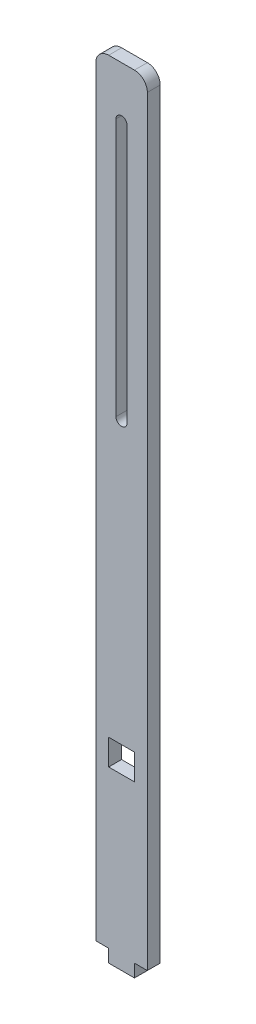
ISO-10303-21;
HEADER;
FILE_DESCRIPTION(('STEP AP214'),'2;1');
FILE_NAME('part.step','',(''),(''),'','','');
FILE_SCHEMA(('AUTOMOTIVE_DESIGN { 1 0 10303 214 1 1 1 1 }'));
ENDSEC;
DATA;
#1=APPLICATION_CONTEXT('core data for automotive mechanical design processes');
#2=APPLICATION_PROTOCOL_DEFINITION('international standard','automotive_design',2000,#1);
#3=PRODUCT_CONTEXT('',#1,'mechanical');
#4=PRODUCT('Part','Part','',(#3));
#5=PRODUCT_RELATED_PRODUCT_CATEGORY('part','',(#4));
#6=PRODUCT_DEFINITION_FORMATION('','',#4);
#7=PRODUCT_DEFINITION_CONTEXT('part definition',#1,'design');
#8=PRODUCT_DEFINITION('design','',#6,#7);
#9=PRODUCT_DEFINITION_SHAPE('','',#8);
#10=(LENGTH_UNIT() NAMED_UNIT(*) SI_UNIT(.MILLI.,.METRE.));
#11=(NAMED_UNIT(*) PLANE_ANGLE_UNIT() SI_UNIT($,.RADIAN.));
#12=(NAMED_UNIT(*) SI_UNIT($,.STERADIAN.) SOLID_ANGLE_UNIT());
#13=UNCERTAINTY_MEASURE_WITH_UNIT(LENGTH_MEASURE(1.E-05),#10,'distance_accuracy_value','');
#14=(GEOMETRIC_REPRESENTATION_CONTEXT(3) GLOBAL_UNCERTAINTY_ASSIGNED_CONTEXT((#13)) GLOBAL_UNIT_ASSIGNED_CONTEXT((#10,
#11,#12)) REPRESENTATION_CONTEXT('',''));
#15=CARTESIAN_POINT('',(0.,0.,0.));
#16=DIRECTION('',(0.,0.,1.));
#17=DIRECTION('',(1.,0.,0.));
#18=AXIS2_PLACEMENT_3D('',#15,#16,#17);
#19=CARTESIAN_POINT('',(12.7,190.5,6.35));
#20=DIRECTION('',(-1.,0.,0.));
#21=DIRECTION('',(0.,-1.,0.));
#22=AXIS2_PLACEMENT_3D('',#19,#20,#21);
#23=PLANE('',#22);
#24=DIRECTION('',(0.,1.,0.));
#25=VECTOR('',#24,1.);
#26=CARTESIAN_POINT('',(12.7,190.5,0.));
#27=LINE('',#26,#25);
#28=CARTESIAN_POINT('',(12.7,-190.5,0.));
#29=VERTEX_POINT('',#28);
#30=CARTESIAN_POINT('',(12.7,184.15,0.));
#31=VERTEX_POINT('',#30);
#32=EDGE_CURVE('E256',#29,#31,#27,.T.);
#33=ORIENTED_EDGE('',*,*,#32,.T.);
#34=DIRECTION('',(0.,0.,-1.));
#35=VECTOR('',#34,1.);
#36=CARTESIAN_POINT('',(12.7,184.15,6.35));
#37=LINE('',#36,#35);
#38=CARTESIAN_POINT('',(12.7,184.15,6.35));
#39=VERTEX_POINT('',#38);
#40=EDGE_CURVE('E11',#31,#39,#37,.F.);
#41=ORIENTED_EDGE('',*,*,#40,.T.);
#42=DIRECTION('',(0.,1.,0.));
#43=VECTOR('',#42,1.);
#44=CARTESIAN_POINT('',(12.7,190.5,6.35));
#45=LINE('',#44,#43);
#46=CARTESIAN_POINT('',(12.7,-190.5,6.35));
#47=VERTEX_POINT('',#46);
#48=EDGE_CURVE('E266',#47,#39,#45,.T.);
#49=ORIENTED_EDGE('',*,*,#48,.F.);
#50=DIRECTION('',(0.,0.,-1.));
#51=VECTOR('',#50,1.);
#52=CARTESIAN_POINT('',(12.7,-190.5,6.35));
#53=LINE('',#52,#51);
#54=EDGE_CURVE('E291',#47,#29,#53,.T.);
#55=ORIENTED_EDGE('',*,*,#54,.T.);
#56=EDGE_LOOP('',(#33,#41,#49,#55));
#57=FACE_BOUND('',#56,.T.);
#58=ADVANCED_FACE('F38',(#57),#23,.F.);
#59=CARTESIAN_POINT('',(-12.7,190.5,6.35));
#60=DIRECTION('',(0.,-1.,0.));
#61=DIRECTION('',(0.,0.,-1.));
#62=AXIS2_PLACEMENT_3D('',#59,#60,#61);
#63=PLANE('',#62);
#64=DIRECTION('',(-1.,0.,0.));
#65=VECTOR('',#64,1.);
#66=CARTESIAN_POINT('',(-12.7,190.5,0.));
#67=LINE('',#66,#65);
#68=CARTESIAN_POINT('',(6.34999999999997,190.5,0.));
#69=VERTEX_POINT('',#68);
#70=CARTESIAN_POINT('',(-6.35000000000002,190.5,0.));
#71=VERTEX_POINT('',#70);
#72=EDGE_CURVE('E294',#69,#71,#67,.T.);
#73=ORIENTED_EDGE('',*,*,#72,.T.);
#74=DIRECTION('',(0.,0.,-1.));
#75=VECTOR('',#74,1.);
#76=CARTESIAN_POINT('',(-6.35000000000002,190.5,6.35));
#77=LINE('',#76,#75);
#78=CARTESIAN_POINT('',(-6.35000000000002,190.5,6.35));
#79=VERTEX_POINT('',#78);
#80=EDGE_CURVE('E60',#71,#79,#77,.F.);
#81=ORIENTED_EDGE('',*,*,#80,.T.);
#82=DIRECTION('',(-1.,0.,0.));
#83=VECTOR('',#82,1.);
#84=CARTESIAN_POINT('',(-12.7,190.5,6.35));
#85=LINE('',#84,#83);
#86=CARTESIAN_POINT('',(6.34999999999997,190.5,6.35));
#87=VERTEX_POINT('',#86);
#88=EDGE_CURVE('E269',#87,#79,#85,.T.);
#89=ORIENTED_EDGE('',*,*,#88,.F.);
#90=DIRECTION('',(0.,0.,-1.));
#91=VECTOR('',#90,1.);
#92=CARTESIAN_POINT('',(6.34999999999997,190.5,6.35));
#93=LINE('',#92,#91);
#94=EDGE_CURVE('E347',#87,#69,#93,.T.);
#95=ORIENTED_EDGE('',*,*,#94,.T.);
#96=EDGE_LOOP('',(#73,#81,#89,#95));
#97=FACE_BOUND('',#96,.T.);
#98=ADVANCED_FACE('F371',(#97),#63,.F.);
#99=CARTESIAN_POINT('',(-12.7,190.5,6.35));
#100=DIRECTION('',(1.,0.,0.));
#101=DIRECTION('',(0.,1.,0.));
#102=AXIS2_PLACEMENT_3D('',#99,#100,#101);
#103=PLANE('',#102);
#104=DIRECTION('',(0.,-1.,0.));
#105=VECTOR('',#104,1.);
#106=CARTESIAN_POINT('',(-12.7,190.5,6.35));
#107=LINE('',#106,#105);
#108=CARTESIAN_POINT('',(-12.7,184.15,6.35));
#109=VERTEX_POINT('',#108);
#110=CARTESIAN_POINT('',(-12.7,-190.5,6.35));
#111=VERTEX_POINT('',#110);
#112=EDGE_CURVE('E273',#109,#111,#107,.T.);
#113=ORIENTED_EDGE('',*,*,#112,.F.);
#114=DIRECTION('',(0.,0.,-1.));
#115=VECTOR('',#114,1.);
#116=CARTESIAN_POINT('',(-12.7,184.15,6.35));
#117=LINE('',#116,#115);
#118=CARTESIAN_POINT('',(-12.7,184.15,0.));
#119=VERTEX_POINT('',#118);
#120=EDGE_CURVE('E337',#109,#119,#117,.T.);
#121=ORIENTED_EDGE('',*,*,#120,.T.);
#122=DIRECTION('',(0.,-1.,0.));
#123=VECTOR('',#122,1.);
#124=CARTESIAN_POINT('',(-12.7,190.5,0.));
#125=LINE('',#124,#123);
#126=CARTESIAN_POINT('',(-12.7,-190.5,0.));
#127=VERTEX_POINT('',#126);
#128=EDGE_CURVE('E297',#119,#127,#125,.T.);
#129=ORIENTED_EDGE('',*,*,#128,.T.);
#130=DIRECTION('',(0.,0.,-1.));
#131=VECTOR('',#130,1.);
#132=CARTESIAN_POINT('',(-12.7,-190.5,6.35));
#133=LINE('',#132,#131);
#134=EDGE_CURVE('E333',#111,#127,#133,.T.);
#135=ORIENTED_EDGE('',*,*,#134,.F.);
#136=EDGE_LOOP('',(#113,#121,#129,#135));
#137=FACE_BOUND('',#136,.T.);
#138=ADVANCED_FACE('F364',(#137),#103,.F.);
#139=CARTESIAN_POINT('',(-12.7,-190.5,6.35));
#140=DIRECTION('',(0.,1.,0.));
#141=DIRECTION('',(0.,0.,1.));
#142=AXIS2_PLACEMENT_3D('',#139,#140,#141);
#143=PLANE('',#142);
#144=DIRECTION('',(1.,0.,0.));
#145=VECTOR('',#144,1.);
#146=CARTESIAN_POINT('',(-12.7,-190.5,0.));
#147=LINE('',#146,#145);
#148=CARTESIAN_POINT('',(-6.34999999999998,-190.5,0.));
#149=VERTEX_POINT('',#148);
#150=EDGE_CURVE('E300',#127,#149,#147,.T.);
#151=ORIENTED_EDGE('',*,*,#150,.T.);
#152=DIRECTION('',(0.,0.,-1.));
#153=VECTOR('',#152,1.);
#154=CARTESIAN_POINT('',(-6.34999999999998,-190.5,6.35));
#155=LINE('',#154,#153);
#156=CARTESIAN_POINT('',(-6.34999999999998,-190.5,6.35));
#157=VERTEX_POINT('',#156);
#158=EDGE_CURVE('E329',#157,#149,#155,.T.);
#159=ORIENTED_EDGE('',*,*,#158,.F.);
#160=DIRECTION('',(1.,0.,0.));
#161=VECTOR('',#160,1.);
#162=CARTESIAN_POINT('',(-12.7,-190.5,6.35));
#163=LINE('',#162,#161);
#164=EDGE_CURVE('E276',#111,#157,#163,.T.);
#165=ORIENTED_EDGE('',*,*,#164,.F.);
#166=ORIENTED_EDGE('',*,*,#134,.T.);
#167=EDGE_LOOP('',(#151,#159,#165,#166));
#168=FACE_BOUND('',#167,.T.);
#169=ADVANCED_FACE('F398',(#168),#143,.F.);
#170=CARTESIAN_POINT('',(-6.34999999999998,-190.5,6.35));
#171=DIRECTION('',(1.,0.,0.));
#172=DIRECTION('',(0.,0.,-1.));
#173=AXIS2_PLACEMENT_3D('',#170,#171,#172);
#174=PLANE('',#173);
#175=DIRECTION('',(0.,-1.,0.));
#176=VECTOR('',#175,1.);
#177=CARTESIAN_POINT('',(-6.34999999999998,-190.5,0.));
#178=LINE('',#177,#176);
#179=CARTESIAN_POINT('',(-6.34999999999998,-196.85,0.));
#180=VERTEX_POINT('',#179);
#181=EDGE_CURVE('E303',#149,#180,#178,.T.);
#182=ORIENTED_EDGE('',*,*,#181,.T.);
#183=DIRECTION('',(0.,0.,-1.));
#184=VECTOR('',#183,1.);
#185=CARTESIAN_POINT('',(-6.34999999999998,-196.85,6.35));
#186=LINE('',#185,#184);
#187=CARTESIAN_POINT('',(-6.34999999999998,-196.85,6.35));
#188=VERTEX_POINT('',#187);
#189=EDGE_CURVE('E325',#188,#180,#186,.T.);
#190=ORIENTED_EDGE('',*,*,#189,.F.);
#191=DIRECTION('',(0.,-1.,0.));
#192=VECTOR('',#191,1.);
#193=CARTESIAN_POINT('',(-6.34999999999998,-190.5,6.35));
#194=LINE('',#193,#192);
#195=EDGE_CURVE('E279',#157,#188,#194,.T.);
#196=ORIENTED_EDGE('',*,*,#195,.F.);
#197=ORIENTED_EDGE('',*,*,#158,.T.);
#198=EDGE_LOOP('',(#182,#190,#196,#197));
#199=FACE_BOUND('',#198,.T.);
#200=ADVANCED_FACE('F395',(#199),#174,.F.);
#201=CARTESIAN_POINT('',(-6.34999999999998,-196.85,6.35));
#202=DIRECTION('',(0.,1.,0.));
#203=DIRECTION('',(0.,0.,1.));
#204=AXIS2_PLACEMENT_3D('',#201,#202,#203);
#205=PLANE('',#204);
#206=DIRECTION('',(1.,0.,0.));
#207=VECTOR('',#206,1.);
#208=CARTESIAN_POINT('',(-6.34999999999998,-196.85,0.));
#209=LINE('',#208,#207);
#210=CARTESIAN_POINT('',(6.35000000000002,-196.85,0.));
#211=VERTEX_POINT('',#210);
#212=EDGE_CURVE('E306',#180,#211,#209,.T.);
#213=ORIENTED_EDGE('',*,*,#212,.T.);
#214=DIRECTION('',(0.,0.,-1.));
#215=VECTOR('',#214,1.);
#216=CARTESIAN_POINT('',(6.35000000000002,-196.85,6.35));
#217=LINE('',#216,#215);
#218=CARTESIAN_POINT('',(6.35000000000002,-196.85,6.35));
#219=VERTEX_POINT('',#218);
#220=EDGE_CURVE('E321',#219,#211,#217,.T.);
#221=ORIENTED_EDGE('',*,*,#220,.F.);
#222=DIRECTION('',(1.,0.,0.));
#223=VECTOR('',#222,1.);
#224=CARTESIAN_POINT('',(-6.34999999999998,-196.85,6.35));
#225=LINE('',#224,#223);
#226=EDGE_CURVE('E282',#188,#219,#225,.T.);
#227=ORIENTED_EDGE('',*,*,#226,.F.);
#228=ORIENTED_EDGE('',*,*,#189,.T.);
#229=EDGE_LOOP('',(#213,#221,#227,#228));
#230=FACE_BOUND('',#229,.T.);
#231=ADVANCED_FACE('F391',(#230),#205,.F.);
#232=CARTESIAN_POINT('',(6.35000000000002,-190.5,6.35));
#233=DIRECTION('',(-1.,0.,0.));
#234=DIRECTION('',(0.,-1.,0.));
#235=AXIS2_PLACEMENT_3D('',#232,#233,#234);
#236=PLANE('',#235);
#237=DIRECTION('',(0.,1.,0.));
#238=VECTOR('',#237,1.);
#239=CARTESIAN_POINT('',(6.35000000000002,-190.5,0.));
#240=LINE('',#239,#238);
#241=CARTESIAN_POINT('',(6.35000000000002,-190.5,0.));
#242=VERTEX_POINT('',#241);
#243=EDGE_CURVE('E309',#211,#242,#240,.T.);
#244=ORIENTED_EDGE('',*,*,#243,.T.);
#245=DIRECTION('',(0.,0.,-1.));
#246=VECTOR('',#245,1.);
#247=CARTESIAN_POINT('',(6.35000000000002,-190.5,6.35));
#248=LINE('',#247,#246);
#249=CARTESIAN_POINT('',(6.35000000000002,-190.5,6.35));
#250=VERTEX_POINT('',#249);
#251=EDGE_CURVE('E317',#250,#242,#248,.T.);
#252=ORIENTED_EDGE('',*,*,#251,.F.);
#253=DIRECTION('',(0.,1.,0.));
#254=VECTOR('',#253,1.);
#255=CARTESIAN_POINT('',(6.35000000000002,-190.5,6.35));
#256=LINE('',#255,#254);
#257=EDGE_CURVE('E285',#219,#250,#256,.T.);
#258=ORIENTED_EDGE('',*,*,#257,.F.);
#259=ORIENTED_EDGE('',*,*,#220,.T.);
#260=EDGE_LOOP('',(#244,#252,#258,#259));
#261=FACE_BOUND('',#260,.T.);
#262=ADVANCED_FACE('F386',(#261),#236,.F.);
#263=CARTESIAN_POINT('',(6.35000000000002,-190.5,6.35));
#264=DIRECTION('',(0.,1.,0.));
#265=DIRECTION('',(-1.,0.,0.));
#266=AXIS2_PLACEMENT_3D('',#263,#264,#265);
#267=PLANE('',#266);
#268=DIRECTION('',(1.,0.,0.));
#269=VECTOR('',#268,1.);
#270=CARTESIAN_POINT('',(6.35000000000002,-190.5,0.));
#271=LINE('',#270,#269);
#272=EDGE_CURVE('E270',#242,#29,#271,.T.);
#273=ORIENTED_EDGE('',*,*,#272,.T.);
#274=ORIENTED_EDGE('',*,*,#54,.F.);
#275=DIRECTION('',(1.,0.,0.));
#276=VECTOR('',#275,1.);
#277=CARTESIAN_POINT('',(6.35000000000002,-190.5,6.35));
#278=LINE('',#277,#276);
#279=EDGE_CURVE('E288',#250,#47,#278,.T.);
#280=ORIENTED_EDGE('',*,*,#279,.F.);
#281=ORIENTED_EDGE('',*,*,#251,.T.);
#282=EDGE_LOOP('',(#273,#274,#280,#281));
#283=FACE_BOUND('',#282,.T.);
#284=ADVANCED_FACE('F380',(#283),#267,.F.);
#285=CARTESIAN_POINT('',(0.,0.,6.35));
#286=DIRECTION('',(0.,0.,1.));
#287=DIRECTION('',(1.,0.,0.));
#288=AXIS2_PLACEMENT_3D('',#285,#286,#287);
#289=PLANE('',#288);
#290=CARTESIAN_POINT('',(0.,165.1,6.35));
#291=DIRECTION('',(0.,0.,1.));
#292=DIRECTION('',(1.,0.,0.));
#293=AXIS2_PLACEMENT_3D('',#290,#291,#292);
#294=CIRCLE('',#293,2.75);
#295=CARTESIAN_POINT('',(2.75,165.1,6.35));
#296=VERTEX_POINT('',#295);
#297=CARTESIAN_POINT('',(-2.75,165.1,6.35));
#298=VERTEX_POINT('',#297);
#299=EDGE_CURVE('E173',#296,#298,#294,.T.);
#300=ORIENTED_EDGE('',*,*,#299,.F.);
#301=DIRECTION('',(0.,1.,0.));
#302=VECTOR('',#301,1.);
#303=CARTESIAN_POINT('',(2.75,165.1,6.35));
#304=LINE('',#303,#302);
#305=CARTESIAN_POINT('',(2.75000000000002,38.1,6.35));
#306=VERTEX_POINT('',#305);
#307=EDGE_CURVE('E194',#306,#296,#304,.T.);
#308=ORIENTED_EDGE('',*,*,#307,.F.);
#309=CARTESIAN_POINT('',(0.,38.1,6.35));
#310=DIRECTION('',(0.,0.,1.));
#311=DIRECTION('',(1.,0.,0.));
#312=AXIS2_PLACEMENT_3D('',#309,#310,#311);
#313=CIRCLE('',#312,2.75);
#314=CARTESIAN_POINT('',(-2.74999999999998,38.1,6.35));
#315=VERTEX_POINT('',#314);
#316=EDGE_CURVE('E198',#315,#306,#313,.T.);
#317=ORIENTED_EDGE('',*,*,#316,.F.);
#318=DIRECTION('',(0.,-1.,0.));
#319=VECTOR('',#318,1.);
#320=CARTESIAN_POINT('',(-2.75,165.1,6.35));
#321=LINE('',#320,#319);
#322=EDGE_CURVE('E207',#298,#315,#321,.T.);
#323=ORIENTED_EDGE('',*,*,#322,.F.);
#324=EDGE_LOOP('',(#300,#308,#317,#323));
#325=FACE_BOUND('',#324,.T.);
#326=DIRECTION('',(0.,1.,0.));
#327=VECTOR('',#326,1.);
#328=CARTESIAN_POINT('',(6.35000000000002,-100.47478,6.35));
#329=LINE('',#328,#327);
#330=CARTESIAN_POINT('',(6.35000000000002,-113.17478,6.35));
#331=VERTEX_POINT('',#330);
#332=CARTESIAN_POINT('',(6.35000000000002,-100.47478,6.35));
#333=VERTEX_POINT('',#332);
#334=EDGE_CURVE('E216',#331,#333,#329,.T.);
#335=ORIENTED_EDGE('',*,*,#334,.F.);
#336=DIRECTION('',(1.,0.,0.));
#337=VECTOR('',#336,1.);
#338=CARTESIAN_POINT('',(-6.34999999999998,-113.17478,6.35));
#339=LINE('',#338,#337);
#340=CARTESIAN_POINT('',(-6.34999999999998,-113.17478,6.35));
#341=VERTEX_POINT('',#340);
#342=EDGE_CURVE('E227',#341,#331,#339,.T.);
#343=ORIENTED_EDGE('',*,*,#342,.F.);
#344=DIRECTION('',(0.,-1.,0.));
#345=VECTOR('',#344,1.);
#346=CARTESIAN_POINT('',(-6.34999999999998,-100.47478,6.35));
#347=LINE('',#346,#345);
#348=CARTESIAN_POINT('',(-6.34999999999998,-100.47478,6.35));
#349=VERTEX_POINT('',#348);
#350=EDGE_CURVE('E246',#349,#341,#347,.T.);
#351=ORIENTED_EDGE('',*,*,#350,.F.);
#352=DIRECTION('',(-1.,0.,0.));
#353=VECTOR('',#352,1.);
#354=CARTESIAN_POINT('',(-6.34999999999998,-100.47478,6.35));
#355=LINE('',#354,#353);
#356=EDGE_CURVE('E242',#333,#349,#355,.T.);
#357=ORIENTED_EDGE('',*,*,#356,.F.);
#358=EDGE_LOOP('',(#335,#343,#351,#357));
#359=FACE_BOUND('',#358,.T.);
#360=ORIENTED_EDGE('',*,*,#88,.T.);
#361=CARTESIAN_POINT('',(-6.35000000000002,184.15,6.35));
#362=DIRECTION('',(0.,0.,1.));
#363=DIRECTION('',(1.,0.,0.));
#364=AXIS2_PLACEMENT_3D('',#361,#362,#363);
#365=CIRCLE('',#364,6.35);
#366=EDGE_CURVE('E47',#79,#109,#365,.T.);
#367=ORIENTED_EDGE('',*,*,#366,.T.);
#368=ORIENTED_EDGE('',*,*,#112,.T.);
#369=ORIENTED_EDGE('',*,*,#164,.T.);
#370=ORIENTED_EDGE('',*,*,#195,.T.);
#371=ORIENTED_EDGE('',*,*,#226,.T.);
#372=ORIENTED_EDGE('',*,*,#257,.T.);
#373=ORIENTED_EDGE('',*,*,#279,.T.);
#374=ORIENTED_EDGE('',*,*,#48,.T.);
#375=CARTESIAN_POINT('',(6.34999999999997,184.15,6.35));
#376=DIRECTION('',(0.,0.,1.));
#377=DIRECTION('',(1.,0.,0.));
#378=AXIS2_PLACEMENT_3D('',#375,#376,#377);
#379=CIRCLE('',#378,6.35);
#380=EDGE_CURVE('E353',#39,#87,#379,.T.);
#381=ORIENTED_EDGE('',*,*,#380,.T.);
#382=EDGE_LOOP('',(#360,#367,#368,#369,#370,#371,#372,#373,#374,#381));
#383=FACE_BOUND('',#382,.T.);
#384=ADVANCED_FACE('F359',(#325,#359,#383),#289,.T.);
#385=CARTESIAN_POINT('',(0.,0.,0.));
#386=DIRECTION('',(0.,0.,1.));
#387=DIRECTION('',(1.,0.,0.));
#388=AXIS2_PLACEMENT_3D('',#385,#386,#387);
#389=PLANE('',#388);
#390=DIRECTION('',(0.,1.,0.));
#391=VECTOR('',#390,1.);
#392=CARTESIAN_POINT('',(2.75,165.1,0.));
#393=LINE('',#392,#391);
#394=CARTESIAN_POINT('',(2.75000000000002,38.1,0.));
#395=VERTEX_POINT('',#394);
#396=CARTESIAN_POINT('',(2.75,165.1,0.));
#397=VERTEX_POINT('',#396);
#398=EDGE_CURVE('E179',#395,#397,#393,.T.);
#399=ORIENTED_EDGE('',*,*,#398,.T.);
#400=CARTESIAN_POINT('',(0.,165.1,0.));
#401=DIRECTION('',(0.,0.,1.));
#402=DIRECTION('',(1.,0.,0.));
#403=AXIS2_PLACEMENT_3D('',#400,#401,#402);
#404=CIRCLE('',#403,2.75);
#405=CARTESIAN_POINT('',(-2.75,165.1,0.));
#406=VERTEX_POINT('',#405);
#407=EDGE_CURVE('E170',#397,#406,#404,.T.);
#408=ORIENTED_EDGE('',*,*,#407,.T.);
#409=DIRECTION('',(0.,-1.,0.));
#410=VECTOR('',#409,1.);
#411=CARTESIAN_POINT('',(-2.75,165.1,0.));
#412=LINE('',#411,#410);
#413=CARTESIAN_POINT('',(-2.74999999999998,38.1,0.));
#414=VERTEX_POINT('',#413);
#415=EDGE_CURVE('E183',#406,#414,#412,.T.);
#416=ORIENTED_EDGE('',*,*,#415,.T.);
#417=CARTESIAN_POINT('',(0.,38.1,0.));
#418=DIRECTION('',(0.,0.,1.));
#419=DIRECTION('',(1.,0.,0.));
#420=AXIS2_PLACEMENT_3D('',#417,#418,#419);
#421=CIRCLE('',#420,2.75);
#422=EDGE_CURVE('E188',#414,#395,#421,.T.);
#423=ORIENTED_EDGE('',*,*,#422,.T.);
#424=EDGE_LOOP('',(#399,#408,#416,#423));
#425=FACE_BOUND('',#424,.T.);
#426=DIRECTION('',(1.,0.,0.));
#427=VECTOR('',#426,1.);
#428=CARTESIAN_POINT('',(-6.34999999999998,-113.17478,0.));
#429=LINE('',#428,#427);
#430=CARTESIAN_POINT('',(-6.34999999999998,-113.17478,0.));
#431=VERTEX_POINT('',#430);
#432=CARTESIAN_POINT('',(6.35000000000002,-113.17478,0.));
#433=VERTEX_POINT('',#432);
#434=EDGE_CURVE('E235',#431,#433,#429,.T.);
#435=ORIENTED_EDGE('',*,*,#434,.T.);
#436=DIRECTION('',(0.,1.,0.));
#437=VECTOR('',#436,1.);
#438=CARTESIAN_POINT('',(6.35000000000002,-100.47478,0.));
#439=LINE('',#438,#437);
#440=CARTESIAN_POINT('',(6.35000000000002,-100.47478,0.));
#441=VERTEX_POINT('',#440);
#442=EDGE_CURVE('E222',#433,#441,#439,.T.);
#443=ORIENTED_EDGE('',*,*,#442,.T.);
#444=DIRECTION('',(-1.,0.,0.));
#445=VECTOR('',#444,1.);
#446=CARTESIAN_POINT('',(-6.34999999999998,-100.47478,0.));
#447=LINE('',#446,#445);
#448=CARTESIAN_POINT('',(-6.34999999999998,-100.47478,0.));
#449=VERTEX_POINT('',#448);
#450=EDGE_CURVE('E226',#441,#449,#447,.T.);
#451=ORIENTED_EDGE('',*,*,#450,.T.);
#452=DIRECTION('',(0.,-1.,0.));
#453=VECTOR('',#452,1.);
#454=CARTESIAN_POINT('',(-6.34999999999998,-100.47478,0.));
#455=LINE('',#454,#453);
#456=EDGE_CURVE('E231',#449,#431,#455,.T.);
#457=ORIENTED_EDGE('',*,*,#456,.T.);
#458=EDGE_LOOP('',(#435,#443,#451,#457));
#459=FACE_BOUND('',#458,.T.);
#460=ORIENTED_EDGE('',*,*,#128,.F.);
#461=CARTESIAN_POINT('',(-6.35000000000002,184.15,0.));
#462=DIRECTION('',(0.,0.,1.));
#463=DIRECTION('',(1.,0.,0.));
#464=AXIS2_PLACEMENT_3D('',#461,#462,#463);
#465=CIRCLE('',#464,6.35);
#466=EDGE_CURVE('E344',#119,#71,#465,.F.);
#467=ORIENTED_EDGE('',*,*,#466,.T.);
#468=ORIENTED_EDGE('',*,*,#72,.F.);
#469=CARTESIAN_POINT('',(6.34999999999997,184.15,0.));
#470=DIRECTION('',(0.,0.,1.));
#471=DIRECTION('',(1.,0.,0.));
#472=AXIS2_PLACEMENT_3D('',#469,#470,#471);
#473=CIRCLE('',#472,6.35);
#474=EDGE_CURVE('E341',#69,#31,#473,.F.);
#475=ORIENTED_EDGE('',*,*,#474,.T.);
#476=ORIENTED_EDGE('',*,*,#32,.F.);
#477=ORIENTED_EDGE('',*,*,#272,.F.);
#478=ORIENTED_EDGE('',*,*,#243,.F.);
#479=ORIENTED_EDGE('',*,*,#212,.F.);
#480=ORIENTED_EDGE('',*,*,#181,.F.);
#481=ORIENTED_EDGE('',*,*,#150,.F.);
#482=EDGE_LOOP('',(#460,#467,#468,#475,#476,#477,#478,#479,#480,#481));
#483=FACE_BOUND('',#482,.T.);
#484=ADVANCED_FACE('F190',(#425,#459,#483),#389,.F.);
#485=CARTESIAN_POINT('',(6.35000000000002,-100.47478,0.));
#486=DIRECTION('',(1.,0.,0.));
#487=DIRECTION('',(0.,1.,0.));
#488=AXIS2_PLACEMENT_3D('',#485,#486,#487);
#489=PLANE('',#488);
#490=ORIENTED_EDGE('',*,*,#334,.T.);
#491=DIRECTION('',(0.,0.,1.));
#492=VECTOR('',#491,1.);
#493=CARTESIAN_POINT('',(6.35000000000002,-100.47478,0.));
#494=LINE('',#493,#492);
#495=EDGE_CURVE('E239',#441,#333,#494,.T.);
#496=ORIENTED_EDGE('',*,*,#495,.F.);
#497=ORIENTED_EDGE('',*,*,#442,.F.);
#498=DIRECTION('',(0.,0.,1.));
#499=VECTOR('',#498,1.);
#500=CARTESIAN_POINT('',(6.35000000000002,-113.17478,0.));
#501=LINE('',#500,#499);
#502=EDGE_CURVE('E253',#433,#331,#501,.T.);
#503=ORIENTED_EDGE('',*,*,#502,.T.);
#504=EDGE_LOOP('',(#490,#496,#497,#503));
#505=FACE_BOUND('',#504,.T.);
#506=ADVANCED_FACE('F436',(#505),#489,.F.);
#507=CARTESIAN_POINT('',(-6.34999999999998,-113.17478,0.));
#508=DIRECTION('',(0.,-1.,0.));
#509=DIRECTION('',(0.,0.,-1.));
#510=AXIS2_PLACEMENT_3D('',#507,#508,#509);
#511=PLANE('',#510);
#512=ORIENTED_EDGE('',*,*,#342,.T.);
#513=ORIENTED_EDGE('',*,*,#502,.F.);
#514=ORIENTED_EDGE('',*,*,#434,.F.);
#515=DIRECTION('',(0.,0.,1.));
#516=VECTOR('',#515,1.);
#517=CARTESIAN_POINT('',(-6.34999999999998,-113.17478,0.));
#518=LINE('',#517,#516);
#519=EDGE_CURVE('E257',#431,#341,#518,.T.);
#520=ORIENTED_EDGE('',*,*,#519,.T.);
#521=EDGE_LOOP('',(#512,#513,#514,#520));
#522=FACE_BOUND('',#521,.T.);
#523=ADVANCED_FACE('F432',(#522),#511,.F.);
#524=CARTESIAN_POINT('',(-6.34999999999998,-100.47478,0.));
#525=DIRECTION('',(-1.,0.,0.));
#526=DIRECTION('',(0.,-1.,0.));
#527=AXIS2_PLACEMENT_3D('',#524,#525,#526);
#528=PLANE('',#527);
#529=ORIENTED_EDGE('',*,*,#350,.T.);
#530=ORIENTED_EDGE('',*,*,#519,.F.);
#531=ORIENTED_EDGE('',*,*,#456,.F.);
#532=DIRECTION('',(0.,0.,1.));
#533=VECTOR('',#532,1.);
#534=CARTESIAN_POINT('',(-6.34999999999998,-100.47478,0.));
#535=LINE('',#534,#533);
#536=EDGE_CURVE('E260',#449,#349,#535,.T.);
#537=ORIENTED_EDGE('',*,*,#536,.T.);
#538=EDGE_LOOP('',(#529,#530,#531,#537));
#539=FACE_BOUND('',#538,.T.);
#540=ADVANCED_FACE('F435',(#539),#528,.F.);
#541=CARTESIAN_POINT('',(-6.34999999999998,-100.47478,0.));
#542=DIRECTION('',(0.,1.,0.));
#543=DIRECTION('',(0.,0.,1.));
#544=AXIS2_PLACEMENT_3D('',#541,#542,#543);
#545=PLANE('',#544);
#546=ORIENTED_EDGE('',*,*,#356,.T.);
#547=ORIENTED_EDGE('',*,*,#536,.F.);
#548=ORIENTED_EDGE('',*,*,#450,.F.);
#549=ORIENTED_EDGE('',*,*,#495,.T.);
#550=EDGE_LOOP('',(#546,#547,#548,#549));
#551=FACE_BOUND('',#550,.T.);
#552=ADVANCED_FACE('F431',(#551),#545,.F.);
#553=CARTESIAN_POINT('',(0.,165.1,0.));
#554=DIRECTION('',(0.,0.,1.));
#555=DIRECTION('',(1.,0.,0.));
#556=AXIS2_PLACEMENT_3D('',#553,#554,#555);
#557=CYLINDRICAL_SURFACE('',#556,2.75);
#558=ORIENTED_EDGE('',*,*,#299,.T.);
#559=DIRECTION('',(0.,0.,1.));
#560=VECTOR('',#559,1.);
#561=CARTESIAN_POINT('',(-2.75,165.1,0.));
#562=LINE('',#561,#560);
#563=EDGE_CURVE('E166',#406,#298,#562,.T.);
#564=ORIENTED_EDGE('',*,*,#563,.F.);
#565=ORIENTED_EDGE('',*,*,#407,.F.);
#566=DIRECTION('',(0.,0.,1.));
#567=VECTOR('',#566,1.);
#568=CARTESIAN_POINT('',(2.75,165.1,0.));
#569=LINE('',#568,#567);
#570=EDGE_CURVE('E213',#397,#296,#569,.T.);
#571=ORIENTED_EDGE('',*,*,#570,.T.);
#572=EDGE_LOOP('',(#558,#564,#565,#571));
#573=FACE_BOUND('',#572,.T.);
#574=ADVANCED_FACE('F168',(#573),#557,.F.);
#575=CARTESIAN_POINT('',(2.75,165.1,0.));
#576=DIRECTION('',(1.,0.,0.));
#577=DIRECTION('',(0.,1.,0.));
#578=AXIS2_PLACEMENT_3D('',#575,#576,#577);
#579=PLANE('',#578);
#580=ORIENTED_EDGE('',*,*,#307,.T.);
#581=ORIENTED_EDGE('',*,*,#570,.F.);
#582=ORIENTED_EDGE('',*,*,#398,.F.);
#583=DIRECTION('',(0.,0.,1.));
#584=VECTOR('',#583,1.);
#585=CARTESIAN_POINT('',(2.75000000000002,38.1,0.));
#586=LINE('',#585,#584);
#587=EDGE_CURVE('E217',#395,#306,#586,.T.);
#588=ORIENTED_EDGE('',*,*,#587,.T.);
#589=EDGE_LOOP('',(#580,#581,#582,#588));
#590=FACE_BOUND('',#589,.T.);
#591=ADVANCED_FACE('F424',(#590),#579,.F.);
#592=CARTESIAN_POINT('',(0.,38.1,0.));
#593=DIRECTION('',(0.,0.,1.));
#594=DIRECTION('',(1.,0.,0.));
#595=AXIS2_PLACEMENT_3D('',#592,#593,#594);
#596=CYLINDRICAL_SURFACE('',#595,2.75);
#597=ORIENTED_EDGE('',*,*,#316,.T.);
#598=ORIENTED_EDGE('',*,*,#587,.F.);
#599=ORIENTED_EDGE('',*,*,#422,.F.);
#600=DIRECTION('',(0.,0.,1.));
#601=VECTOR('',#600,1.);
#602=CARTESIAN_POINT('',(-2.74999999999998,38.1,0.));
#603=LINE('',#602,#601);
#604=EDGE_CURVE('E178',#414,#315,#603,.T.);
#605=ORIENTED_EDGE('',*,*,#604,.T.);
#606=EDGE_LOOP('',(#597,#598,#599,#605));
#607=FACE_BOUND('',#606,.T.);
#608=ADVANCED_FACE('F420',(#607),#596,.F.);
#609=CARTESIAN_POINT('',(-2.75,165.1,0.));
#610=DIRECTION('',(-1.,0.,0.));
#611=DIRECTION('',(0.,-1.,0.));
#612=AXIS2_PLACEMENT_3D('',#609,#610,#611);
#613=PLANE('',#612);
#614=ORIENTED_EDGE('',*,*,#322,.T.);
#615=ORIENTED_EDGE('',*,*,#604,.F.);
#616=ORIENTED_EDGE('',*,*,#415,.F.);
#617=ORIENTED_EDGE('',*,*,#563,.T.);
#618=EDGE_LOOP('',(#614,#615,#616,#617));
#619=FACE_BOUND('',#618,.T.);
#620=ADVANCED_FACE('F184',(#619),#613,.F.);
#621=CARTESIAN_POINT('',(-6.35000000000002,184.15,6.35));
#622=DIRECTION('',(0.,0.,-1.));
#623=DIRECTION('',(-1.,0.,0.));
#624=AXIS2_PLACEMENT_3D('',#621,#622,#623);
#625=CYLINDRICAL_SURFACE('',#624,6.35);
#626=ORIENTED_EDGE('',*,*,#366,.F.);
#627=ORIENTED_EDGE('',*,*,#80,.F.);
#628=ORIENTED_EDGE('',*,*,#466,.F.);
#629=ORIENTED_EDGE('',*,*,#120,.F.);
#630=EDGE_LOOP('',(#626,#627,#628,#629));
#631=FACE_BOUND('',#630,.T.);
#632=ADVANCED_FACE('F367',(#631),#625,.T.);
#633=CARTESIAN_POINT('',(6.34999999999997,184.15,6.35));
#634=DIRECTION('',(0.,0.,-1.));
#635=DIRECTION('',(-1.,0.,0.));
#636=AXIS2_PLACEMENT_3D('',#633,#634,#635);
#637=CYLINDRICAL_SURFACE('',#636,6.35);
#638=ORIENTED_EDGE('',*,*,#380,.F.);
#639=ORIENTED_EDGE('',*,*,#40,.F.);
#640=ORIENTED_EDGE('',*,*,#474,.F.);
#641=ORIENTED_EDGE('',*,*,#94,.F.);
#642=EDGE_LOOP('',(#638,#639,#640,#641));
#643=FACE_BOUND('',#642,.T.);
#644=ADVANCED_FACE('F40',(#643),#637,.T.);
#645=CLOSED_SHELL('',(#58,#98,#138,#169,#200,#231,#262,#284,#384,#484,#506,#523,#540,#552,#574,
#591,#608,#620,#632,#644));
#646=MANIFOLD_SOLID_BREP('B2',#645);
#647=ADVANCED_BREP_SHAPE_REPRESENTATION('',(#18,#646),#14);
#648=SHAPE_DEFINITION_REPRESENTATION(#9,#647);
ENDSEC;
END-ISO-10303-21;
